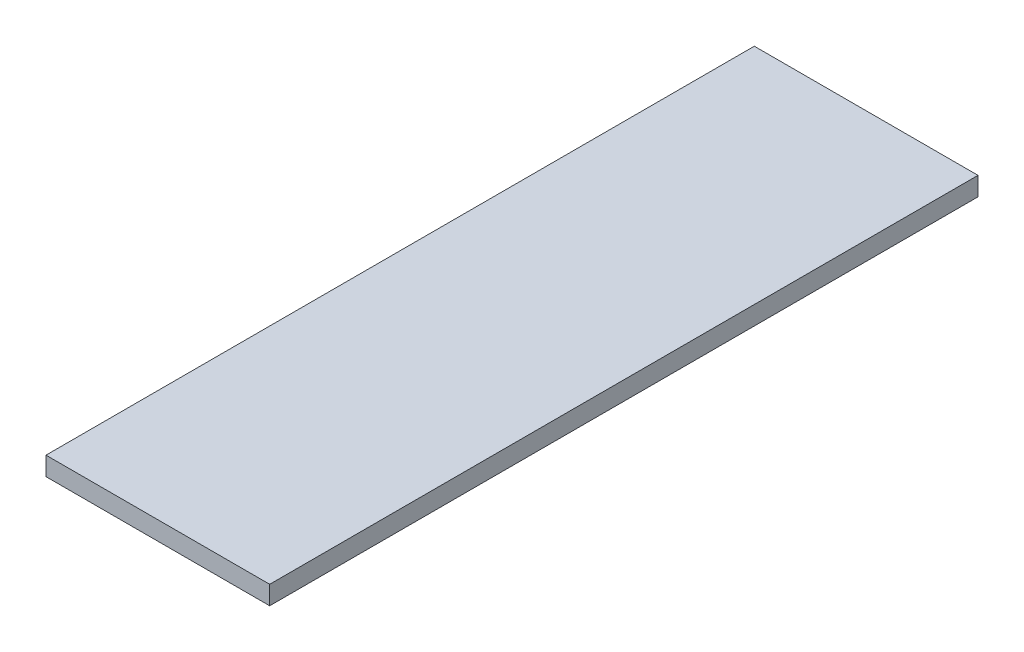
ISO-10303-21;
HEADER;
FILE_DESCRIPTION(('STEP AP214'),'2;1');
FILE_NAME('part.step','',(''),(''),'','','');
FILE_SCHEMA(('AUTOMOTIVE_DESIGN { 1 0 10303 214 1 1 1 1 }'));
ENDSEC;
DATA;
#1=APPLICATION_CONTEXT('core data for automotive mechanical design processes');
#2=APPLICATION_PROTOCOL_DEFINITION('international standard','automotive_design',2000,#1);
#3=PRODUCT_CONTEXT('',#1,'mechanical');
#4=PRODUCT('Part','Part','',(#3));
#5=PRODUCT_RELATED_PRODUCT_CATEGORY('part','',(#4));
#6=PRODUCT_DEFINITION_FORMATION('','',#4);
#7=PRODUCT_DEFINITION_CONTEXT('part definition',#1,'design');
#8=PRODUCT_DEFINITION('design','',#6,#7);
#9=PRODUCT_DEFINITION_SHAPE('','',#8);
#10=(LENGTH_UNIT() NAMED_UNIT(*) SI_UNIT(.MILLI.,.METRE.));
#11=(NAMED_UNIT(*) PLANE_ANGLE_UNIT() SI_UNIT($,.RADIAN.));
#12=(NAMED_UNIT(*) SI_UNIT($,.STERADIAN.) SOLID_ANGLE_UNIT());
#13=UNCERTAINTY_MEASURE_WITH_UNIT(LENGTH_MEASURE(1.E-05),#10,'distance_accuracy_value','');
#14=(GEOMETRIC_REPRESENTATION_CONTEXT(3) GLOBAL_UNCERTAINTY_ASSIGNED_CONTEXT((#13)) GLOBAL_UNIT_ASSIGNED_CONTEXT((#10,
#11,#12)) REPRESENTATION_CONTEXT('',''));
#15=CARTESIAN_POINT('',(0.,0.,0.));
#16=DIRECTION('',(0.,0.,1.));
#17=DIRECTION('',(1.,0.,0.));
#18=AXIS2_PLACEMENT_3D('',#15,#16,#17);
#19=CARTESIAN_POINT('',(9.,1.5,28.5));
#20=DIRECTION('',(-1.,0.,0.));
#21=DIRECTION('',(0.,0.,1.));
#22=AXIS2_PLACEMENT_3D('',#19,#20,#21);
#23=PLANE('',#22);
#24=DIRECTION('',(0.,0.,-1.));
#25=VECTOR('',#24,1.);
#26=CARTESIAN_POINT('',(9.,0.,28.5));
#27=LINE('',#26,#25);
#28=CARTESIAN_POINT('',(9.,0.,28.5));
#29=VERTEX_POINT('',#28);
#30=CARTESIAN_POINT('',(9.,0.,-28.5));
#31=VERTEX_POINT('',#30);
#32=EDGE_CURVE('E102',#29,#31,#27,.T.);
#33=ORIENTED_EDGE('',*,*,#32,.T.);
#34=DIRECTION('',(0.,-1.,0.));
#35=VECTOR('',#34,1.);
#36=CARTESIAN_POINT('',(9.,1.5,-28.5));
#37=LINE('',#36,#35);
#38=CARTESIAN_POINT('',(9.,1.5,-28.5));
#39=VERTEX_POINT('',#38);
#40=EDGE_CURVE('E11',#39,#31,#37,.T.);
#41=ORIENTED_EDGE('',*,*,#40,.F.);
#42=DIRECTION('',(0.,0.,-1.));
#43=VECTOR('',#42,1.);
#44=CARTESIAN_POINT('',(9.,1.5,28.5));
#45=LINE('',#44,#43);
#46=CARTESIAN_POINT('',(9.,1.5,28.5));
#47=VERTEX_POINT('',#46);
#48=EDGE_CURVE('E90',#47,#39,#45,.T.);
#49=ORIENTED_EDGE('',*,*,#48,.F.);
#50=DIRECTION('',(0.,-1.,0.));
#51=VECTOR('',#50,1.);
#52=CARTESIAN_POINT('',(9.,1.5,28.5));
#53=LINE('',#52,#51);
#54=EDGE_CURVE('E98',#47,#29,#53,.T.);
#55=ORIENTED_EDGE('',*,*,#54,.T.);
#56=EDGE_LOOP('',(#33,#41,#49,#55));
#57=FACE_BOUND('',#56,.T.);
#58=ADVANCED_FACE('F39',(#57),#23,.F.);
#59=CARTESIAN_POINT('',(-9.,1.5,-28.5));
#60=DIRECTION('',(0.,0.,1.));
#61=DIRECTION('',(1.,0.,0.));
#62=AXIS2_PLACEMENT_3D('',#59,#60,#61);
#63=PLANE('',#62);
#64=DIRECTION('',(-1.,0.,0.));
#65=VECTOR('',#64,1.);
#66=CARTESIAN_POINT('',(-9.,0.,-28.5));
#67=LINE('',#66,#65);
#68=CARTESIAN_POINT('',(-9.,0.,-28.5));
#69=VERTEX_POINT('',#68);
#70=EDGE_CURVE('E94',#31,#69,#67,.T.);
#71=ORIENTED_EDGE('',*,*,#70,.T.);
#72=DIRECTION('',(0.,-1.,0.));
#73=VECTOR('',#72,1.);
#74=CARTESIAN_POINT('',(-9.,1.5,-28.5));
#75=LINE('',#74,#73);
#76=CARTESIAN_POINT('',(-9.,1.5,-28.5));
#77=VERTEX_POINT('',#76);
#78=EDGE_CURVE('E47',#77,#69,#75,.T.);
#79=ORIENTED_EDGE('',*,*,#78,.F.);
#80=DIRECTION('',(-1.,0.,0.));
#81=VECTOR('',#80,1.);
#82=CARTESIAN_POINT('',(-9.,1.5,-28.5));
#83=LINE('',#82,#81);
#84=EDGE_CURVE('E85',#39,#77,#83,.T.);
#85=ORIENTED_EDGE('',*,*,#84,.F.);
#86=ORIENTED_EDGE('',*,*,#40,.T.);
#87=EDGE_LOOP('',(#71,#79,#85,#86));
#88=FACE_BOUND('',#87,.T.);
#89=ADVANCED_FACE('F93',(#88),#63,.F.);
#90=CARTESIAN_POINT('',(-9.,1.5,28.5));
#91=DIRECTION('',(1.,0.,0.));
#92=DIRECTION('',(0.,0.,-1.));
#93=AXIS2_PLACEMENT_3D('',#90,#91,#92);
#94=PLANE('',#93);
#95=DIRECTION('',(0.,0.,1.));
#96=VECTOR('',#95,1.);
#97=CARTESIAN_POINT('',(-9.,0.,28.5));
#98=LINE('',#97,#96);
#99=CARTESIAN_POINT('',(-9.,0.,28.5));
#100=VERTEX_POINT('',#99);
#101=EDGE_CURVE('E72',#69,#100,#98,.T.);
#102=ORIENTED_EDGE('',*,*,#101,.T.);
#103=DIRECTION('',(0.,-1.,0.));
#104=VECTOR('',#103,1.);
#105=CARTESIAN_POINT('',(-9.,1.5,28.5));
#106=LINE('',#105,#104);
#107=CARTESIAN_POINT('',(-9.,1.5,28.5));
#108=VERTEX_POINT('',#107);
#109=EDGE_CURVE('E95',#108,#100,#106,.T.);
#110=ORIENTED_EDGE('',*,*,#109,.F.);
#111=DIRECTION('',(0.,0.,1.));
#112=VECTOR('',#111,1.);
#113=CARTESIAN_POINT('',(-9.,1.5,28.5));
#114=LINE('',#113,#112);
#115=EDGE_CURVE('E88',#77,#108,#114,.T.);
#116=ORIENTED_EDGE('',*,*,#115,.F.);
#117=ORIENTED_EDGE('',*,*,#78,.T.);
#118=EDGE_LOOP('',(#102,#110,#116,#117));
#119=FACE_BOUND('',#118,.T.);
#120=ADVANCED_FACE('F96',(#119),#94,.F.);
#121=CARTESIAN_POINT('',(-9.,1.5,28.5));
#122=DIRECTION('',(0.,0.,-1.));
#123=DIRECTION('',(-1.,0.,0.));
#124=AXIS2_PLACEMENT_3D('',#121,#122,#123);
#125=PLANE('',#124);
#126=DIRECTION('',(1.,0.,0.));
#127=VECTOR('',#126,1.);
#128=CARTESIAN_POINT('',(-9.,0.,28.5));
#129=LINE('',#128,#127);
#130=EDGE_CURVE('E78',#100,#29,#129,.T.);
#131=ORIENTED_EDGE('',*,*,#130,.T.);
#132=ORIENTED_EDGE('',*,*,#54,.F.);
#133=DIRECTION('',(1.,0.,0.));
#134=VECTOR('',#133,1.);
#135=CARTESIAN_POINT('',(-9.,1.5,28.5));
#136=LINE('',#135,#134);
#137=EDGE_CURVE('E55',#108,#47,#136,.T.);
#138=ORIENTED_EDGE('',*,*,#137,.F.);
#139=ORIENTED_EDGE('',*,*,#109,.T.);
#140=EDGE_LOOP('',(#131,#132,#138,#139));
#141=FACE_BOUND('',#140,.T.);
#142=ADVANCED_FACE('F109',(#141),#125,.F.);
#143=CARTESIAN_POINT('',(0.,1.5,0.));
#144=DIRECTION('',(0.,-1.,0.));
#145=DIRECTION('',(0.,0.,-1.));
#146=AXIS2_PLACEMENT_3D('',#143,#144,#145);
#147=PLANE('',#146);
#148=ORIENTED_EDGE('',*,*,#48,.T.);
#149=ORIENTED_EDGE('',*,*,#84,.T.);
#150=ORIENTED_EDGE('',*,*,#115,.T.);
#151=ORIENTED_EDGE('',*,*,#137,.T.);
#152=EDGE_LOOP('',(#148,#149,#150,#151));
#153=FACE_BOUND('',#152,.T.);
#154=ADVANCED_FACE('F86',(#153),#147,.F.);
#155=CARTESIAN_POINT('',(0.,0.,0.));
#156=DIRECTION('',(0.,-1.,0.));
#157=DIRECTION('',(0.,0.,-1.));
#158=AXIS2_PLACEMENT_3D('',#155,#156,#157);
#159=PLANE('',#158);
#160=ORIENTED_EDGE('',*,*,#32,.F.);
#161=ORIENTED_EDGE('',*,*,#130,.F.);
#162=ORIENTED_EDGE('',*,*,#101,.F.);
#163=ORIENTED_EDGE('',*,*,#70,.F.);
#164=EDGE_LOOP('',(#160,#161,#162,#163));
#165=FACE_BOUND('',#164,.T.);
#166=ADVANCED_FACE('F112',(#165),#159,.T.);
#167=CLOSED_SHELL('',(#58,#89,#120,#142,#154,#166));
#168=MANIFOLD_SOLID_BREP('B2',#167);
#169=ADVANCED_BREP_SHAPE_REPRESENTATION('',(#18,#168),#14);
#170=SHAPE_DEFINITION_REPRESENTATION(#9,#169);
ENDSEC;
END-ISO-10303-21;
